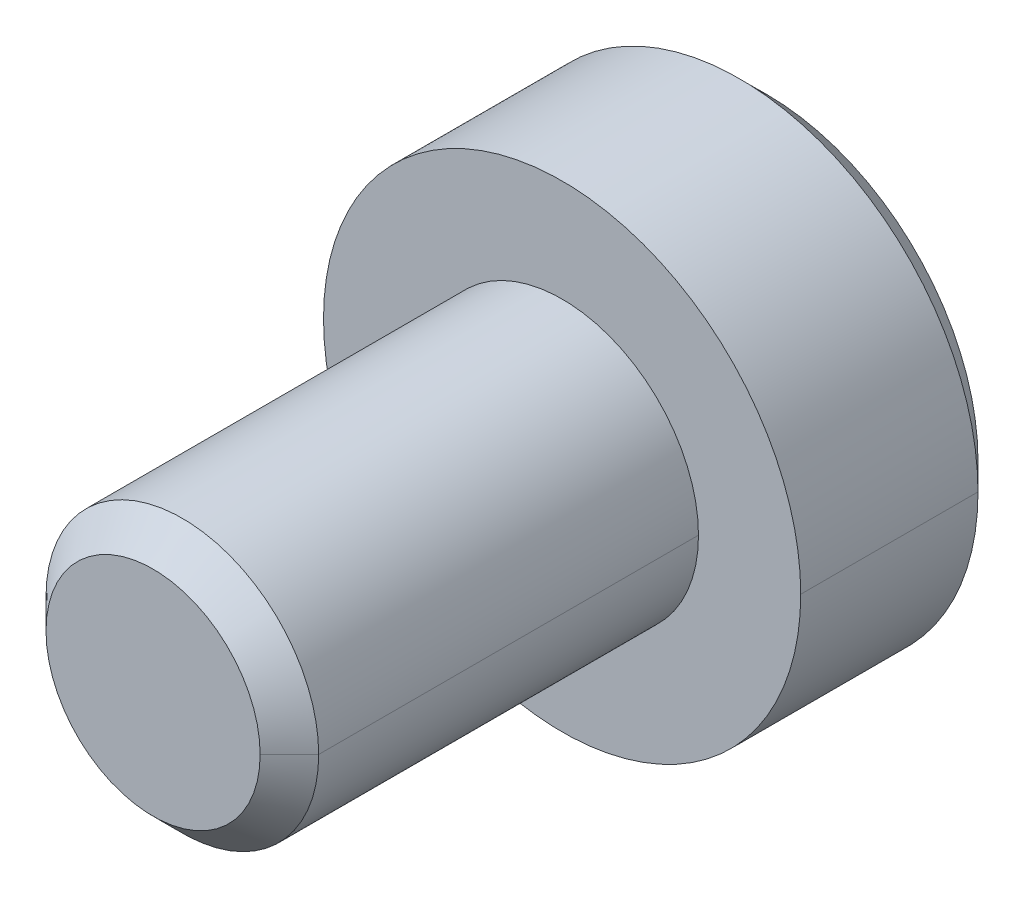
ISO-10303-21;
HEADER;
FILE_DESCRIPTION(('STEP AP214'),'2;1');
FILE_NAME('part.step','',(''),(''),'','','');
FILE_SCHEMA(('AUTOMOTIVE_DESIGN { 1 0 10303 214 1 1 1 1 }'));
ENDSEC;
DATA;
#1=APPLICATION_CONTEXT('core data for automotive mechanical design processes');
#2=APPLICATION_PROTOCOL_DEFINITION('international standard','automotive_design',2000,#1);
#3=PRODUCT_CONTEXT('',#1,'mechanical');
#4=PRODUCT('Part','Part','',(#3));
#5=PRODUCT_RELATED_PRODUCT_CATEGORY('part','',(#4));
#6=PRODUCT_DEFINITION_FORMATION('','',#4);
#7=PRODUCT_DEFINITION_CONTEXT('part definition',#1,'design');
#8=PRODUCT_DEFINITION('design','',#6,#7);
#9=PRODUCT_DEFINITION_SHAPE('','',#8);
#10=(LENGTH_UNIT() NAMED_UNIT(*) SI_UNIT(.MILLI.,.METRE.));
#11=(NAMED_UNIT(*) PLANE_ANGLE_UNIT() SI_UNIT($,.RADIAN.));
#12=(NAMED_UNIT(*) SI_UNIT($,.STERADIAN.) SOLID_ANGLE_UNIT());
#13=UNCERTAINTY_MEASURE_WITH_UNIT(LENGTH_MEASURE(1.E-05),#10,'distance_accuracy_value','');
#14=(GEOMETRIC_REPRESENTATION_CONTEXT(3) GLOBAL_UNCERTAINTY_ASSIGNED_CONTEXT((#13)) GLOBAL_UNIT_ASSIGNED_CONTEXT((#10,
#11,#12)) REPRESENTATION_CONTEXT('',''));
#15=CARTESIAN_POINT('',(0.,0.,0.));
#16=DIRECTION('',(0.,0.,1.));
#17=DIRECTION('',(1.,0.,0.));
#18=AXIS2_PLACEMENT_3D('',#15,#16,#17);
#19=CARTESIAN_POINT('',(0.,0.,2.));
#20=DIRECTION('',(0.,0.,-1.));
#21=DIRECTION('',(0.,-1.,0.));
#22=AXIS2_PLACEMENT_3D('',#19,#20,#21);
#23=PLANE('',#22);
#24=DIRECTION('',(0.866025403784439,0.5,0.));
#25=VECTOR('',#24,1.);
#26=CARTESIAN_POINT('',(-1.5,0.866025403784439,2.));
#27=LINE('',#26,#25);
#28=CARTESIAN_POINT('',(-1.5,0.866025403784439,2.));
#29=VERTEX_POINT('',#28);
#30=CARTESIAN_POINT('',(0.,1.73205080756888,2.));
#31=VERTEX_POINT('',#30);
#32=EDGE_CURVE('E231',#29,#31,#27,.T.);
#33=ORIENTED_EDGE('',*,*,#32,.T.);
#34=DIRECTION('',(0.866025403784439,-0.5,0.));
#35=VECTOR('',#34,1.);
#36=CARTESIAN_POINT('',(0.,1.73205080756888,2.));
#37=LINE('',#36,#35);
#38=CARTESIAN_POINT('',(1.5,0.866025403784439,2.));
#39=VERTEX_POINT('',#38);
#40=EDGE_CURVE('E9',#31,#39,#37,.T.);
#41=ORIENTED_EDGE('',*,*,#40,.T.);
#42=DIRECTION('',(0.,-1.,0.));
#43=VECTOR('',#42,1.);
#44=CARTESIAN_POINT('',(1.5,0.866025403784439,2.));
#45=LINE('',#44,#43);
#46=CARTESIAN_POINT('',(1.5,-0.866025403784439,2.));
#47=VERTEX_POINT('',#46);
#48=EDGE_CURVE('E42',#39,#47,#45,.T.);
#49=ORIENTED_EDGE('',*,*,#48,.T.);
#50=DIRECTION('',(-0.866025403784439,-0.5,0.));
#51=VECTOR('',#50,1.);
#52=CARTESIAN_POINT('',(1.5,-0.866025403784439,2.));
#53=LINE('',#52,#51);
#54=CARTESIAN_POINT('',(0.,-1.73205080756888,2.));
#55=VERTEX_POINT('',#54);
#56=EDGE_CURVE('E249',#47,#55,#53,.T.);
#57=ORIENTED_EDGE('',*,*,#56,.T.);
#58=DIRECTION('',(-0.866025403784439,0.5,0.));
#59=VECTOR('',#58,1.);
#60=CARTESIAN_POINT('',(0.,-1.73205080756888,2.));
#61=LINE('',#60,#59);
#62=CARTESIAN_POINT('',(-1.5,-0.86602540378444,2.));
#63=VERTEX_POINT('',#62);
#64=EDGE_CURVE('E232',#55,#63,#61,.T.);
#65=ORIENTED_EDGE('',*,*,#64,.T.);
#66=DIRECTION('',(0.,1.,0.));
#67=VECTOR('',#66,1.);
#68=CARTESIAN_POINT('',(-1.5,-0.86602540378444,2.));
#69=LINE('',#68,#67);
#70=EDGE_CURVE('E242',#63,#29,#69,.T.);
#71=ORIENTED_EDGE('',*,*,#70,.T.);
#72=EDGE_LOOP('',(#33,#41,#49,#57,#65,#71));
#73=FACE_BOUND('',#72,.T.);
#74=ADVANCED_FACE('F15',(#73),#23,.T.);
#75=CARTESIAN_POINT('',(0.,1.73205080756888,2.));
#76=DIRECTION('',(0.5,0.866025403784439,0.));
#77=DIRECTION('',(0.,0.,-1.));
#78=AXIS2_PLACEMENT_3D('',#75,#76,#77);
#79=PLANE('',#78);
#80=DIRECTION('',(0.866025403784439,-0.5,0.));
#81=VECTOR('',#80,1.);
#82=CARTESIAN_POINT('',(0.,1.73205080756888,0.));
#83=LINE('',#82,#81);
#84=CARTESIAN_POINT('',(0.,1.73205080756887,0.));
#85=VERTEX_POINT('',#84);
#86=CARTESIAN_POINT('',(1.5,0.866025403784439,0.));
#87=VERTEX_POINT('',#86);
#88=EDGE_CURVE('E185',#85,#87,#83,.T.);
#89=ORIENTED_EDGE('',*,*,#88,.T.);
#90=DIRECTION('',(0.,0.,-1.));
#91=VECTOR('',#90,1.);
#92=CARTESIAN_POINT('',(1.5,0.866025403784439,2.));
#93=LINE('',#92,#91);
#94=EDGE_CURVE('E23',#39,#87,#93,.T.);
#95=ORIENTED_EDGE('',*,*,#94,.F.);
#96=ORIENTED_EDGE('',*,*,#40,.F.);
#97=DIRECTION('',(0.,0.,-1.));
#98=VECTOR('',#97,1.);
#99=CARTESIAN_POINT('',(0.,1.73205080756888,2.));
#100=LINE('',#99,#98);
#101=EDGE_CURVE('E228',#31,#85,#100,.T.);
#102=ORIENTED_EDGE('',*,*,#101,.T.);
#103=EDGE_LOOP('',(#89,#95,#96,#102));
#104=FACE_BOUND('',#103,.T.);
#105=ADVANCED_FACE('F524',(#104),#79,.F.);
#106=CARTESIAN_POINT('',(1.5,0.866025403784439,2.));
#107=DIRECTION('',(1.,0.,0.));
#108=DIRECTION('',(0.,1.,0.));
#109=AXIS2_PLACEMENT_3D('',#106,#107,#108);
#110=PLANE('',#109);
#111=DIRECTION('',(0.,-1.,0.));
#112=VECTOR('',#111,1.);
#113=CARTESIAN_POINT('',(1.5,0.866025403784439,0.));
#114=LINE('',#113,#112);
#115=CARTESIAN_POINT('',(1.5,-0.866025403784439,0.));
#116=VERTEX_POINT('',#115);
#117=EDGE_CURVE('E182',#87,#116,#114,.T.);
#118=ORIENTED_EDGE('',*,*,#117,.T.);
#119=DIRECTION('',(0.,0.,-1.));
#120=VECTOR('',#119,1.);
#121=CARTESIAN_POINT('',(1.5,-0.866025403784439,2.));
#122=LINE('',#121,#120);
#123=EDGE_CURVE('E252',#47,#116,#122,.T.);
#124=ORIENTED_EDGE('',*,*,#123,.F.);
#125=ORIENTED_EDGE('',*,*,#48,.F.);
#126=ORIENTED_EDGE('',*,*,#94,.T.);
#127=EDGE_LOOP('',(#118,#124,#125,#126));
#128=FACE_BOUND('',#127,.T.);
#129=ADVANCED_FACE('F519',(#128),#110,.F.);
#130=CARTESIAN_POINT('',(1.5,-0.866025403784439,2.));
#131=DIRECTION('',(0.5,-0.866025403784439,0.));
#132=DIRECTION('',(0.,0.,-1.));
#133=AXIS2_PLACEMENT_3D('',#130,#131,#132);
#134=PLANE('',#133);
#135=DIRECTION('',(-0.866025403784439,-0.5,0.));
#136=VECTOR('',#135,1.);
#137=CARTESIAN_POINT('',(1.5,-0.866025403784439,0.));
#138=LINE('',#137,#136);
#139=CARTESIAN_POINT('',(0.,-1.73205080756888,0.));
#140=VERTEX_POINT('',#139);
#141=EDGE_CURVE('E218',#116,#140,#138,.T.);
#142=ORIENTED_EDGE('',*,*,#141,.T.);
#143=DIRECTION('',(0.,0.,-1.));
#144=VECTOR('',#143,1.);
#145=CARTESIAN_POINT('',(0.,-1.73205080756888,2.));
#146=LINE('',#145,#144);
#147=EDGE_CURVE('E235',#55,#140,#146,.T.);
#148=ORIENTED_EDGE('',*,*,#147,.F.);
#149=ORIENTED_EDGE('',*,*,#56,.F.);
#150=ORIENTED_EDGE('',*,*,#123,.T.);
#151=EDGE_LOOP('',(#142,#148,#149,#150));
#152=FACE_BOUND('',#151,.T.);
#153=ADVANCED_FACE('F523',(#152),#134,.F.);
#154=CARTESIAN_POINT('',(0.,-1.73205080756888,2.));
#155=DIRECTION('',(-0.5,-0.866025403784439,0.));
#156=DIRECTION('',(-0.866025403784439,0.5,0.));
#157=AXIS2_PLACEMENT_3D('',#154,#155,#156);
#158=PLANE('',#157);
#159=DIRECTION('',(-0.866025403784439,0.5,0.));
#160=VECTOR('',#159,1.);
#161=CARTESIAN_POINT('',(0.,-1.73205080756888,0.));
#162=LINE('',#161,#160);
#163=CARTESIAN_POINT('',(-1.5,-0.86602540378444,0.));
#164=VERTEX_POINT('',#163);
#165=EDGE_CURVE('E214',#140,#164,#162,.T.);
#166=ORIENTED_EDGE('',*,*,#165,.T.);
#167=DIRECTION('',(0.,0.,-1.));
#168=VECTOR('',#167,1.);
#169=CARTESIAN_POINT('',(-1.5,-0.86602540378444,2.));
#170=LINE('',#169,#168);
#171=EDGE_CURVE('E236',#63,#164,#170,.T.);
#172=ORIENTED_EDGE('',*,*,#171,.F.);
#173=ORIENTED_EDGE('',*,*,#64,.F.);
#174=ORIENTED_EDGE('',*,*,#147,.T.);
#175=EDGE_LOOP('',(#166,#172,#173,#174));
#176=FACE_BOUND('',#175,.T.);
#177=ADVANCED_FACE('F562',(#176),#158,.F.);
#178=CARTESIAN_POINT('',(-1.5,-0.86602540378444,2.));
#179=DIRECTION('',(-1.,0.,0.));
#180=DIRECTION('',(0.,1.,0.));
#181=AXIS2_PLACEMENT_3D('',#178,#179,#180);
#182=PLANE('',#181);
#183=DIRECTION('',(0.,1.,0.));
#184=VECTOR('',#183,1.);
#185=CARTESIAN_POINT('',(-1.5,-0.86602540378444,0.));
#186=LINE('',#185,#184);
#187=CARTESIAN_POINT('',(-1.5,0.866025403784439,0.));
#188=VERTEX_POINT('',#187);
#189=EDGE_CURVE('E213',#164,#188,#186,.T.);
#190=ORIENTED_EDGE('',*,*,#189,.T.);
#191=DIRECTION('',(0.,0.,-1.));
#192=VECTOR('',#191,1.);
#193=CARTESIAN_POINT('',(-1.5,0.866025403784439,2.));
#194=LINE('',#193,#192);
#195=EDGE_CURVE('E239',#29,#188,#194,.T.);
#196=ORIENTED_EDGE('',*,*,#195,.F.);
#197=ORIENTED_EDGE('',*,*,#70,.F.);
#198=ORIENTED_EDGE('',*,*,#171,.T.);
#199=EDGE_LOOP('',(#190,#196,#197,#198));
#200=FACE_BOUND('',#199,.T.);
#201=ADVANCED_FACE('F448',(#200),#182,.F.);
#202=CARTESIAN_POINT('',(-1.5,0.866025403784439,2.));
#203=DIRECTION('',(-0.5,0.866025403784439,0.));
#204=DIRECTION('',(0.,0.,1.));
#205=AXIS2_PLACEMENT_3D('',#202,#203,#204);
#206=PLANE('',#205);
#207=DIRECTION('',(0.866025403784439,0.5,0.));
#208=VECTOR('',#207,1.);
#209=CARTESIAN_POINT('',(-1.5,0.866025403784439,0.));
#210=LINE('',#209,#208);
#211=EDGE_CURVE('E209',#188,#85,#210,.T.);
#212=ORIENTED_EDGE('',*,*,#211,.T.);
#213=ORIENTED_EDGE('',*,*,#101,.F.);
#214=ORIENTED_EDGE('',*,*,#32,.F.);
#215=ORIENTED_EDGE('',*,*,#195,.T.);
#216=EDGE_LOOP('',(#212,#213,#214,#215));
#217=FACE_BOUND('',#216,.T.);
#218=ADVANCED_FACE('F442',(#217),#206,.F.);
#219=CARTESIAN_POINT('',(0.,0.,9.));
#220=DIRECTION('',(0.,0.,-1.));
#221=DIRECTION('',(-1.,0.,0.));
#222=AXIS2_PLACEMENT_3D('',#219,#220,#221);
#223=CONICAL_SURFACE('',#222,1.5705,0.785398163397448);
#224=DIRECTION('',(0.707106781186548,0.,-0.707106781186548));
#225=VECTOR('',#224,1.);
#226=CARTESIAN_POINT('',(1.5705,0.,9.));
#227=LINE('',#226,#225);
#228=CARTESIAN_POINT('',(1.5705,0.,9.));
#229=VERTEX_POINT('',#228);
#230=CARTESIAN_POINT('',(2.,0.,8.5705));
#231=VERTEX_POINT('',#230);
#232=EDGE_CURVE('E832',#229,#231,#227,.T.);
#233=ORIENTED_EDGE('',*,*,#232,.F.);
#234=CARTESIAN_POINT('',(0.,0.,9.));
#235=DIRECTION('',(0.,0.,1.));
#236=DIRECTION('',(1.,0.,0.));
#237=AXIS2_PLACEMENT_3D('',#234,#235,#236);
#238=CIRCLE('',#237,1.5705);
#239=CARTESIAN_POINT('',(-1.5705,0.,9.));
#240=VERTEX_POINT('',#239);
#241=EDGE_CURVE('E181',#240,#229,#238,.T.);
#242=ORIENTED_EDGE('',*,*,#241,.F.);
#243=DIRECTION('',(-0.707106781186548,0.,-0.707106781186548));
#244=VECTOR('',#243,1.);
#245=CARTESIAN_POINT('',(-1.5705,0.,9.));
#246=LINE('',#245,#244);
#247=CARTESIAN_POINT('',(-2.,0.,8.5705));
#248=VERTEX_POINT('',#247);
#249=EDGE_CURVE('E174',#240,#248,#246,.T.);
#250=ORIENTED_EDGE('',*,*,#249,.T.);
#251=CARTESIAN_POINT('',(0.,0.,8.5705));
#252=DIRECTION('',(0.,0.,-1.));
#253=DIRECTION('',(1.,0.,0.));
#254=AXIS2_PLACEMENT_3D('',#251,#252,#253);
#255=CIRCLE('',#254,2.);
#256=EDGE_CURVE('E178',#231,#248,#255,.T.);
#257=ORIENTED_EDGE('',*,*,#256,.F.);
#258=EDGE_LOOP('',(#233,#242,#250,#257));
#259=FACE_BOUND('',#258,.T.);
#260=ADVANCED_FACE('F447',(#259),#223,.T.);
#261=CARTESIAN_POINT('',(0.,0.,0.4));
#262=DIRECTION('',(0.,0.,1.));
#263=DIRECTION('',(1.,0.,0.));
#264=AXIS2_PLACEMENT_3D('',#261,#262,#263);
#265=CONICAL_SURFACE('',#264,3.5,0.785398163397449);
#266=DIRECTION('',(-0.707106781186549,0.,0.707106781186547));
#267=VECTOR('',#266,1.);
#268=CARTESIAN_POINT('',(-3.5,0.,0.4));
#269=LINE('',#268,#267);
#270=CARTESIAN_POINT('',(-3.1,0.,0.));
#271=VERTEX_POINT('',#270);
#272=CARTESIAN_POINT('',(-3.5,0.,0.4));
#273=VERTEX_POINT('',#272);
#274=EDGE_CURVE('E138',#271,#273,#269,.T.);
#275=ORIENTED_EDGE('',*,*,#274,.F.);
#276=CARTESIAN_POINT('',(0.,0.,0.));
#277=DIRECTION('',(0.,0.,-1.));
#278=DIRECTION('',(1.,0.,0.));
#279=AXIS2_PLACEMENT_3D('',#276,#277,#278);
#280=CIRCLE('',#279,3.1);
#281=CARTESIAN_POINT('',(3.1,0.,0.));
#282=VERTEX_POINT('',#281);
#283=EDGE_CURVE('E183',#282,#271,#280,.T.);
#284=ORIENTED_EDGE('',*,*,#283,.F.);
#285=DIRECTION('',(0.707106781186549,0.,0.707106781186547));
#286=VECTOR('',#285,1.);
#287=CARTESIAN_POINT('',(3.5,0.,0.4));
#288=LINE('',#287,#286);
#289=CARTESIAN_POINT('',(3.5,0.,0.4));
#290=VERTEX_POINT('',#289);
#291=EDGE_CURVE('E141',#282,#290,#288,.T.);
#292=ORIENTED_EDGE('',*,*,#291,.T.);
#293=CARTESIAN_POINT('',(0.,0.,0.4));
#294=DIRECTION('',(0.,0.,1.));
#295=DIRECTION('',(1.,0.,0.));
#296=AXIS2_PLACEMENT_3D('',#293,#294,#295);
#297=CIRCLE('',#296,3.5);
#298=EDGE_CURVE('E134',#273,#290,#297,.T.);
#299=ORIENTED_EDGE('',*,*,#298,.F.);
#300=EDGE_LOOP('',(#275,#284,#292,#299));
#301=FACE_BOUND('',#300,.T.);
#302=ADVANCED_FACE('F136',(#301),#265,.T.);
#303=CARTESIAN_POINT('',(0.,0.,9.));
#304=DIRECTION('',(0.,0.,1.));
#305=DIRECTION('',(1.,0.,0.));
#306=AXIS2_PLACEMENT_3D('',#303,#304,#305);
#307=PLANE('',#306);
#308=ORIENTED_EDGE('',*,*,#241,.T.);
#309=CARTESIAN_POINT('',(0.,0.,9.));
#310=DIRECTION('',(0.,0.,1.));
#311=DIRECTION('',(1.,0.,0.));
#312=AXIS2_PLACEMENT_3D('',#309,#310,#311);
#313=CIRCLE('',#312,1.5705);
#314=EDGE_CURVE('E839',#229,#240,#313,.T.);
#315=ORIENTED_EDGE('',*,*,#314,.T.);
#316=EDGE_LOOP('',(#308,#315));
#317=FACE_BOUND('',#316,.T.);
#318=ADVANCED_FACE('F544',(#317),#307,.T.);
#319=CARTESIAN_POINT('',(0.,0.,9.));
#320=DIRECTION('',(0.,0.,-1.));
#321=DIRECTION('',(-1.,0.,0.));
#322=AXIS2_PLACEMENT_3D('',#319,#320,#321);
#323=CYLINDRICAL_SURFACE('',#322,2.);
#324=DIRECTION('',(0.,0.,-1.));
#325=VECTOR('',#324,1.);
#326=CARTESIAN_POINT('',(2.,0.,9.));
#327=LINE('',#326,#325);
#328=CARTESIAN_POINT('',(2.,0.,3.));
#329=VERTEX_POINT('',#328);
#330=EDGE_CURVE('E189',#231,#329,#327,.T.);
#331=ORIENTED_EDGE('',*,*,#330,.F.);
#332=ORIENTED_EDGE('',*,*,#256,.T.);
#333=DIRECTION('',(0.,0.,-1.));
#334=VECTOR('',#333,1.);
#335=CARTESIAN_POINT('',(-2.,0.,9.));
#336=LINE('',#335,#334);
#337=CARTESIAN_POINT('',(-2.,0.,3.));
#338=VERTEX_POINT('',#337);
#339=EDGE_CURVE('E194',#248,#338,#336,.T.);
#340=ORIENTED_EDGE('',*,*,#339,.T.);
#341=CARTESIAN_POINT('',(0.,0.,3.));
#342=DIRECTION('',(0.,0.,1.));
#343=DIRECTION('',(1.,0.,0.));
#344=AXIS2_PLACEMENT_3D('',#341,#342,#343);
#345=CIRCLE('',#344,2.);
#346=EDGE_CURVE('E147',#338,#329,#345,.T.);
#347=ORIENTED_EDGE('',*,*,#346,.T.);
#348=EDGE_LOOP('',(#331,#332,#340,#347));
#349=FACE_BOUND('',#348,.T.);
#350=ADVANCED_FACE('F502',(#349),#323,.T.);
#351=CARTESIAN_POINT('',(0.,0.,0.));
#352=DIRECTION('',(0.,0.,1.));
#353=DIRECTION('',(1.,0.,0.));
#354=AXIS2_PLACEMENT_3D('',#351,#352,#353);
#355=PLANE('',#354);
#356=ORIENTED_EDGE('',*,*,#88,.F.);
#357=ORIENTED_EDGE('',*,*,#211,.F.);
#358=ORIENTED_EDGE('',*,*,#189,.F.);
#359=ORIENTED_EDGE('',*,*,#165,.F.);
#360=ORIENTED_EDGE('',*,*,#141,.F.);
#361=ORIENTED_EDGE('',*,*,#117,.F.);
#362=EDGE_LOOP('',(#356,#357,#358,#359,#360,#361));
#363=FACE_BOUND('',#362,.T.);
#364=ORIENTED_EDGE('',*,*,#283,.T.);
#365=CARTESIAN_POINT('',(0.,0.,0.));
#366=DIRECTION('',(0.,0.,-1.));
#367=DIRECTION('',(1.,0.,0.));
#368=AXIS2_PLACEMENT_3D('',#365,#366,#367);
#369=CIRCLE('',#368,3.1);
#370=EDGE_CURVE('E167',#271,#282,#369,.T.);
#371=ORIENTED_EDGE('',*,*,#370,.T.);
#372=EDGE_LOOP('',(#364,#371));
#373=FACE_BOUND('',#372,.T.);
#374=ADVANCED_FACE('F460',(#363,#373),#355,.F.);
#375=CARTESIAN_POINT('',(0.,0.,3.));
#376=DIRECTION('',(0.,0.,1.));
#377=DIRECTION('',(1.,0.,0.));
#378=AXIS2_PLACEMENT_3D('',#375,#376,#377);
#379=PLANE('',#378);
#380=ORIENTED_EDGE('',*,*,#346,.F.);
#381=CARTESIAN_POINT('',(0.,0.,3.));
#382=DIRECTION('',(0.,0.,1.));
#383=DIRECTION('',(1.,0.,0.));
#384=AXIS2_PLACEMENT_3D('',#381,#382,#383);
#385=CIRCLE('',#384,2.);
#386=EDGE_CURVE('E190',#329,#338,#385,.T.);
#387=ORIENTED_EDGE('',*,*,#386,.F.);
#388=EDGE_LOOP('',(#380,#387));
#389=FACE_BOUND('',#388,.T.);
#390=CARTESIAN_POINT('',(0.,0.,3.));
#391=DIRECTION('',(0.,0.,1.));
#392=DIRECTION('',(1.,0.,0.));
#393=AXIS2_PLACEMENT_3D('',#390,#391,#392);
#394=CIRCLE('',#393,3.5);
#395=CARTESIAN_POINT('',(-3.5,0.,3.));
#396=VERTEX_POINT('',#395);
#397=CARTESIAN_POINT('',(3.5,0.,3.));
#398=VERTEX_POINT('',#397);
#399=EDGE_CURVE('E148',#396,#398,#394,.T.);
#400=ORIENTED_EDGE('',*,*,#399,.T.);
#401=CARTESIAN_POINT('',(0.,0.,3.));
#402=DIRECTION('',(0.,0.,1.));
#403=DIRECTION('',(1.,0.,0.));
#404=AXIS2_PLACEMENT_3D('',#401,#402,#403);
#405=CIRCLE('',#404,3.5);
#406=EDGE_CURVE('E195',#398,#396,#405,.T.);
#407=ORIENTED_EDGE('',*,*,#406,.T.);
#408=EDGE_LOOP('',(#400,#407));
#409=FACE_BOUND('',#408,.T.);
#410=ADVANCED_FACE('F456',(#389,#409),#379,.T.);
#411=CARTESIAN_POINT('',(0.,0.,3.));
#412=DIRECTION('',(0.,0.,-1.));
#413=DIRECTION('',(-1.,0.,0.));
#414=AXIS2_PLACEMENT_3D('',#411,#412,#413);
#415=CYLINDRICAL_SURFACE('',#414,3.5);
#416=DIRECTION('',(0.,0.,-1.));
#417=VECTOR('',#416,1.);
#418=CARTESIAN_POINT('',(3.5,0.,3.));
#419=LINE('',#418,#417);
#420=EDGE_CURVE('E158',#398,#290,#419,.T.);
#421=ORIENTED_EDGE('',*,*,#420,.F.);
#422=ORIENTED_EDGE('',*,*,#399,.F.);
#423=DIRECTION('',(0.,0.,-1.));
#424=VECTOR('',#423,1.);
#425=CARTESIAN_POINT('',(-3.5,0.,3.));
#426=LINE('',#425,#424);
#427=EDGE_CURVE('E151',#396,#273,#426,.T.);
#428=ORIENTED_EDGE('',*,*,#427,.T.);
#429=ORIENTED_EDGE('',*,*,#298,.T.);
#430=EDGE_LOOP('',(#421,#422,#428,#429));
#431=FACE_BOUND('',#430,.T.);
#432=ADVANCED_FACE('F153',(#431),#415,.T.);
#433=CARTESIAN_POINT('',(0.,0.,3.));
#434=DIRECTION('',(0.,0.,-1.));
#435=DIRECTION('',(-1.,0.,0.));
#436=AXIS2_PLACEMENT_3D('',#433,#434,#435);
#437=CYLINDRICAL_SURFACE('',#436,3.5);
#438=ORIENTED_EDGE('',*,*,#406,.F.);
#439=ORIENTED_EDGE('',*,*,#420,.T.);
#440=CARTESIAN_POINT('',(0.,0.,0.4));
#441=DIRECTION('',(0.,0.,1.));
#442=DIRECTION('',(1.,0.,0.));
#443=AXIS2_PLACEMENT_3D('',#440,#441,#442);
#444=CIRCLE('',#443,3.5);
#445=EDGE_CURVE('E160',#290,#273,#444,.T.);
#446=ORIENTED_EDGE('',*,*,#445,.T.);
#447=ORIENTED_EDGE('',*,*,#427,.F.);
#448=EDGE_LOOP('',(#438,#439,#446,#447));
#449=FACE_BOUND('',#448,.T.);
#450=ADVANCED_FACE('F161',(#449),#437,.T.);
#451=CARTESIAN_POINT('',(0.,0.,9.));
#452=DIRECTION('',(0.,0.,-1.));
#453=DIRECTION('',(-1.,0.,0.));
#454=AXIS2_PLACEMENT_3D('',#451,#452,#453);
#455=CYLINDRICAL_SURFACE('',#454,2.);
#456=CARTESIAN_POINT('',(0.,0.,8.5705));
#457=DIRECTION('',(0.,0.,-1.));
#458=DIRECTION('',(1.,0.,0.));
#459=AXIS2_PLACEMENT_3D('',#456,#457,#458);
#460=CIRCLE('',#459,2.);
#461=EDGE_CURVE('E398',#248,#231,#460,.T.);
#462=ORIENTED_EDGE('',*,*,#461,.T.);
#463=ORIENTED_EDGE('',*,*,#330,.T.);
#464=ORIENTED_EDGE('',*,*,#386,.T.);
#465=ORIENTED_EDGE('',*,*,#339,.F.);
#466=EDGE_LOOP('',(#462,#463,#464,#465));
#467=FACE_BOUND('',#466,.T.);
#468=ADVANCED_FACE('F472',(#467),#455,.T.);
#469=CARTESIAN_POINT('',(0.,0.,0.4));
#470=DIRECTION('',(0.,0.,1.));
#471=DIRECTION('',(1.,0.,0.));
#472=AXIS2_PLACEMENT_3D('',#469,#470,#471);
#473=CONICAL_SURFACE('',#472,3.5,0.785398163397449);
#474=ORIENTED_EDGE('',*,*,#370,.F.);
#475=ORIENTED_EDGE('',*,*,#274,.T.);
#476=ORIENTED_EDGE('',*,*,#445,.F.);
#477=ORIENTED_EDGE('',*,*,#291,.F.);
#478=EDGE_LOOP('',(#474,#475,#476,#477));
#479=FACE_BOUND('',#478,.T.);
#480=ADVANCED_FACE('F165',(#479),#473,.T.);
#481=CARTESIAN_POINT('',(0.,0.,9.));
#482=DIRECTION('',(0.,0.,-1.));
#483=DIRECTION('',(-1.,0.,0.));
#484=AXIS2_PLACEMENT_3D('',#481,#482,#483);
#485=CONICAL_SURFACE('',#484,1.5705,0.785398163397448);
#486=ORIENTED_EDGE('',*,*,#314,.F.);
#487=ORIENTED_EDGE('',*,*,#232,.T.);
#488=ORIENTED_EDGE('',*,*,#461,.F.);
#489=ORIENTED_EDGE('',*,*,#249,.F.);
#490=EDGE_LOOP('',(#486,#487,#488,#489));
#491=FACE_BOUND('',#490,.T.);
#492=ADVANCED_FACE('F471',(#491),#485,.T.);
#493=CLOSED_SHELL('',(#74,#105,#129,#153,#177,#201,#218,#260,#302,#318,#350,#374,#410,#432,#450,
#468,#480,#492));
#494=MANIFOLD_SOLID_BREP('B1',#493);
#495=ADVANCED_BREP_SHAPE_REPRESENTATION('',(#18,#494),#14);
#496=SHAPE_DEFINITION_REPRESENTATION(#9,#495);
ENDSEC;
END-ISO-10303-21;
